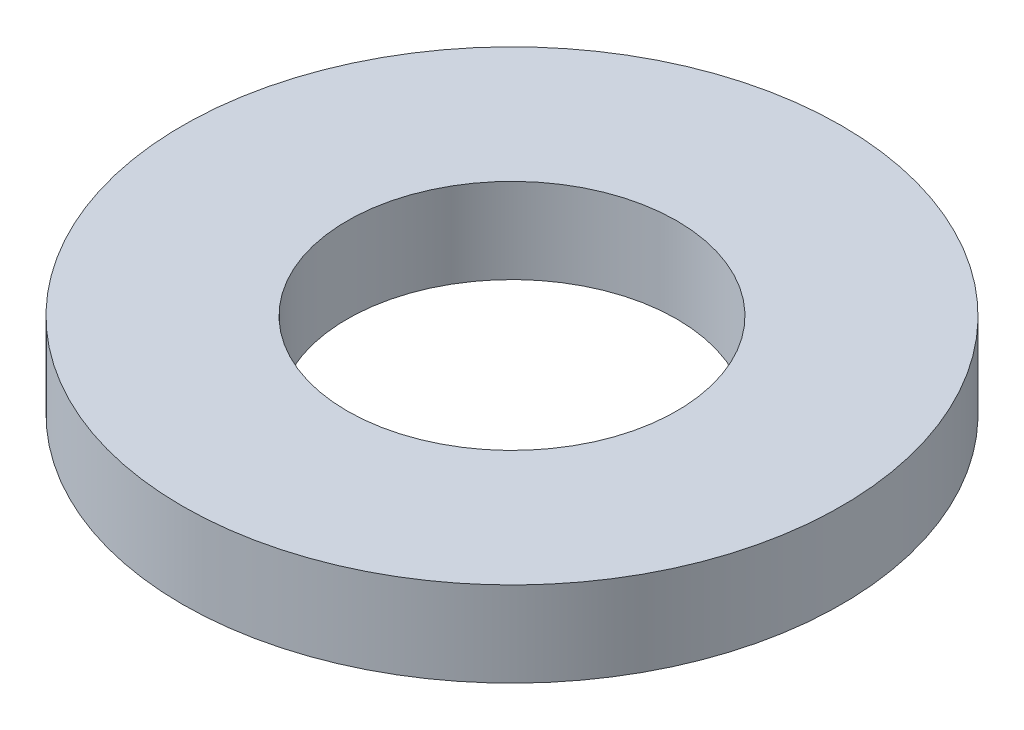
ISO-10303-21;
HEADER;
FILE_DESCRIPTION(('STEP AP214'),'2;1');
FILE_NAME('part.step','',(''),(''),'','','');
FILE_SCHEMA(('AUTOMOTIVE_DESIGN { 1 0 10303 214 1 1 1 1 }'));
ENDSEC;
DATA;
#1=APPLICATION_CONTEXT('core data for automotive mechanical design processes');
#2=APPLICATION_PROTOCOL_DEFINITION('international standard','automotive_design',2000,#1);
#3=PRODUCT_CONTEXT('',#1,'mechanical');
#4=PRODUCT('Part','Part','',(#3));
#5=PRODUCT_RELATED_PRODUCT_CATEGORY('part','',(#4));
#6=PRODUCT_DEFINITION_FORMATION('','',#4);
#7=PRODUCT_DEFINITION_CONTEXT('part definition',#1,'design');
#8=PRODUCT_DEFINITION('design','',#6,#7);
#9=PRODUCT_DEFINITION_SHAPE('','',#8);
#10=(LENGTH_UNIT() NAMED_UNIT(*) SI_UNIT(.MILLI.,.METRE.));
#11=(NAMED_UNIT(*) PLANE_ANGLE_UNIT() SI_UNIT($,.RADIAN.));
#12=(NAMED_UNIT(*) SI_UNIT($,.STERADIAN.) SOLID_ANGLE_UNIT());
#13=UNCERTAINTY_MEASURE_WITH_UNIT(LENGTH_MEASURE(1.E-05),#10,'distance_accuracy_value','');
#14=(GEOMETRIC_REPRESENTATION_CONTEXT(3) GLOBAL_UNCERTAINTY_ASSIGNED_CONTEXT((#13)) GLOBAL_UNIT_ASSIGNED_CONTEXT((#10,
#11,#12)) REPRESENTATION_CONTEXT('',''));
#15=CARTESIAN_POINT('',(0.,0.,0.));
#16=DIRECTION('',(0.,0.,1.));
#17=DIRECTION('',(1.,0.,0.));
#18=AXIS2_PLACEMENT_3D('',#15,#16,#17);
#19=CARTESIAN_POINT('',(0.,0.8,0.));
#20=DIRECTION('',(0.,1.,0.));
#21=DIRECTION('',(0.,0.,1.));
#22=AXIS2_PLACEMENT_3D('',#19,#20,#21);
#23=PLANE('',#22);
#24=CARTESIAN_POINT('',(0.,0.8,0.));
#25=DIRECTION('',(0.,1.,0.));
#26=DIRECTION('',(0.,0.,1.));
#27=AXIS2_PLACEMENT_3D('',#24,#25,#26);
#28=CIRCLE('',#27,1.55);
#29=CARTESIAN_POINT('',(0.,0.8,1.55));
#30=VERTEX_POINT('',#29);
#31=EDGE_CURVE('E27',#30,#30,#28,.F.);
#32=ORIENTED_EDGE('',*,*,#31,.T.);
#33=EDGE_LOOP('',(#32));
#34=FACE_BOUND('',#33,.T.);
#35=CARTESIAN_POINT('',(0.,0.8,0.));
#36=DIRECTION('',(0.,1.,0.));
#37=DIRECTION('',(0.,0.,1.));
#38=AXIS2_PLACEMENT_3D('',#35,#36,#37);
#39=CIRCLE('',#38,3.1);
#40=CARTESIAN_POINT('',(0.,0.8,3.1));
#41=VERTEX_POINT('',#40);
#42=EDGE_CURVE('E18',#41,#41,#39,.F.);
#43=ORIENTED_EDGE('',*,*,#42,.F.);
#44=EDGE_LOOP('',(#43));
#45=FACE_BOUND('',#44,.T.);
#46=ADVANCED_FACE('F15',(#34,#45),#23,.T.);
#47=CARTESIAN_POINT('',(0.,0.,0.));
#48=DIRECTION('',(0.,1.,0.));
#49=DIRECTION('',(0.,0.,1.));
#50=AXIS2_PLACEMENT_3D('',#47,#48,#49);
#51=CYLINDRICAL_SURFACE('',#50,3.1);
#52=ORIENTED_EDGE('',*,*,#42,.T.);
#53=EDGE_LOOP('',(#52));
#54=FACE_BOUND('',#53,.T.);
#55=CARTESIAN_POINT('',(0.,0.,0.));
#56=DIRECTION('',(0.,1.,0.));
#57=DIRECTION('',(0.,0.,1.));
#58=AXIS2_PLACEMENT_3D('',#55,#56,#57);
#59=CIRCLE('',#58,3.1);
#60=CARTESIAN_POINT('',(0.,0.,3.1));
#61=VERTEX_POINT('',#60);
#62=EDGE_CURVE('E22',#61,#61,#59,.T.);
#63=ORIENTED_EDGE('',*,*,#62,.T.);
#64=EDGE_LOOP('',(#63));
#65=FACE_BOUND('',#64,.T.);
#66=ADVANCED_FACE('F35',(#54,#65),#51,.T.);
#67=CARTESIAN_POINT('',(0.,0.,0.));
#68=DIRECTION('',(0.,1.,0.));
#69=DIRECTION('',(0.,0.,1.));
#70=AXIS2_PLACEMENT_3D('',#67,#68,#69);
#71=CYLINDRICAL_SURFACE('',#70,1.55);
#72=ORIENTED_EDGE('',*,*,#31,.F.);
#73=EDGE_LOOP('',(#72));
#74=FACE_BOUND('',#73,.T.);
#75=CARTESIAN_POINT('',(0.,0.,0.));
#76=DIRECTION('',(0.,1.,0.));
#77=DIRECTION('',(0.,0.,1.));
#78=AXIS2_PLACEMENT_3D('',#75,#76,#77);
#79=CIRCLE('',#78,1.55);
#80=CARTESIAN_POINT('',(0.,0.,1.55));
#81=VERTEX_POINT('',#80);
#82=EDGE_CURVE('E10',#81,#81,#79,.F.);
#83=ORIENTED_EDGE('',*,*,#82,.T.);
#84=EDGE_LOOP('',(#83));
#85=FACE_BOUND('',#84,.T.);
#86=ADVANCED_FACE('F43',(#74,#85),#71,.F.);
#87=CARTESIAN_POINT('',(0.,0.,0.));
#88=DIRECTION('',(0.,1.,0.));
#89=DIRECTION('',(0.,0.,1.));
#90=AXIS2_PLACEMENT_3D('',#87,#88,#89);
#91=PLANE('',#90);
#92=ORIENTED_EDGE('',*,*,#82,.F.);
#93=EDGE_LOOP('',(#92));
#94=FACE_BOUND('',#93,.T.);
#95=ORIENTED_EDGE('',*,*,#62,.F.);
#96=EDGE_LOOP('',(#95));
#97=FACE_BOUND('',#96,.T.);
#98=ADVANCED_FACE('F44',(#94,#97),#91,.F.);
#99=CLOSED_SHELL('',(#46,#66,#86,#98));
#100=MANIFOLD_SOLID_BREP('B1',#99);
#101=ADVANCED_BREP_SHAPE_REPRESENTATION('',(#18,#100),#14);
#102=SHAPE_DEFINITION_REPRESENTATION(#9,#101);
ENDSEC;
END-ISO-10303-21;
